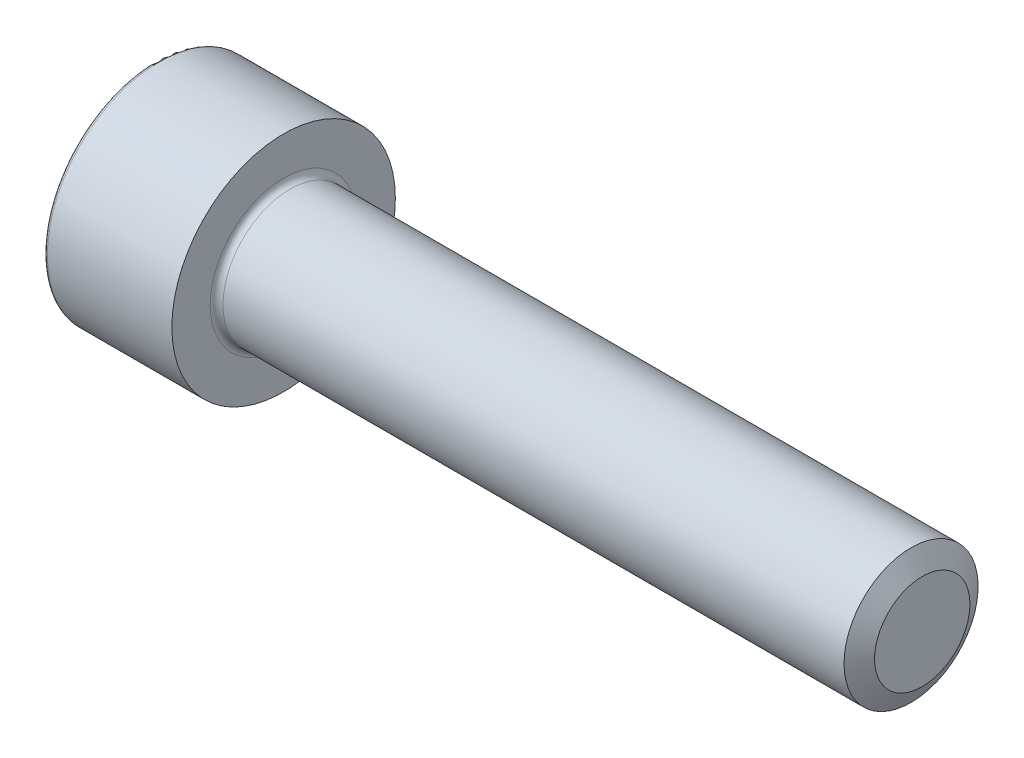
ISO-10303-21;
HEADER;
FILE_DESCRIPTION(('STEP AP214'),'2;1');
FILE_NAME('part.step','',(''),(''),'','','');
FILE_SCHEMA(('AUTOMOTIVE_DESIGN { 1 0 10303 214 1 1 1 1 }'));
ENDSEC;
DATA;
#1=APPLICATION_CONTEXT('core data for automotive mechanical design processes');
#2=APPLICATION_PROTOCOL_DEFINITION('international standard','automotive_design',2000,#1);
#3=PRODUCT_CONTEXT('',#1,'mechanical');
#4=PRODUCT('Part','Part','',(#3));
#5=PRODUCT_RELATED_PRODUCT_CATEGORY('part','',(#4));
#6=PRODUCT_DEFINITION_FORMATION('','',#4);
#7=PRODUCT_DEFINITION_CONTEXT('part definition',#1,'design');
#8=PRODUCT_DEFINITION('design','',#6,#7);
#9=PRODUCT_DEFINITION_SHAPE('','',#8);
#10=(LENGTH_UNIT() NAMED_UNIT(*) SI_UNIT(.MILLI.,.METRE.));
#11=(NAMED_UNIT(*) PLANE_ANGLE_UNIT() SI_UNIT($,.RADIAN.));
#12=(NAMED_UNIT(*) SI_UNIT($,.STERADIAN.) SOLID_ANGLE_UNIT());
#13=UNCERTAINTY_MEASURE_WITH_UNIT(LENGTH_MEASURE(1.E-05),#10,'distance_accuracy_value','');
#14=(GEOMETRIC_REPRESENTATION_CONTEXT(3) GLOBAL_UNCERTAINTY_ASSIGNED_CONTEXT((#13)) GLOBAL_UNIT_ASSIGNED_CONTEXT((#10,
#11,#12)) REPRESENTATION_CONTEXT('',''));
#15=CARTESIAN_POINT('',(0.,0.,0.));
#16=DIRECTION('',(0.,0.,1.));
#17=DIRECTION('',(1.,0.,0.));
#18=AXIS2_PLACEMENT_3D('',#15,#16,#17);
#19=CARTESIAN_POINT('',(0.,0.,0.));
#20=DIRECTION('',(-1.,0.,0.));
#21=DIRECTION('',(0.,0.,1.));
#22=AXIS2_PLACEMENT_3D('',#19,#20,#21);
#23=CYLINDRICAL_SURFACE('',#22,2.1);
#24=CARTESIAN_POINT('',(4.2,0.,0.));
#25=DIRECTION('',(-1.,0.,0.));
#26=DIRECTION('',(0.,0.,1.));
#27=AXIS2_PLACEMENT_3D('',#24,#25,#26);
#28=CIRCLE('',#27,2.1);
#29=CARTESIAN_POINT('',(4.2,0.,2.1));
#30=VERTEX_POINT('',#29);
#31=EDGE_CURVE('E146',#30,#30,#28,.T.);
#32=ORIENTED_EDGE('',*,*,#31,.F.);
#33=EDGE_LOOP('',(#32));
#34=FACE_BOUND('',#33,.T.);
#35=CARTESIAN_POINT('',(23.6500102668172,0.,0.));
#36=DIRECTION('',(-1.,0.,0.));
#37=DIRECTION('',(0.,0.,1.));
#38=AXIS2_PLACEMENT_3D('',#35,#36,#37);
#39=CIRCLE('',#38,2.1);
#40=CARTESIAN_POINT('',(23.6500102668172,0.,2.1));
#41=VERTEX_POINT('',#40);
#42=EDGE_CURVE('E283',#41,#41,#39,.T.);
#43=ORIENTED_EDGE('',*,*,#42,.T.);
#44=EDGE_LOOP('',(#43));
#45=FACE_BOUND('',#44,.T.);
#46=ADVANCED_FACE('F43',(#34,#45),#23,.T.);
#47=CARTESIAN_POINT('',(0.,0.,0.));
#48=DIRECTION('',(1.,0.,0.));
#49=DIRECTION('',(0.,0.,-1.));
#50=AXIS2_PLACEMENT_3D('',#47,#48,#49);
#51=PLANE('',#50);
#52=CARTESIAN_POINT('',(0.,0.,0.));
#53=DIRECTION('',(1.,0.,0.));
#54=DIRECTION('',(0.,0.,-1.));
#55=AXIS2_PLACEMENT_3D('',#52,#53,#54);
#56=CIRCLE('',#55,3.4);
#57=CARTESIAN_POINT('',(0.,0.,-3.4));
#58=VERTEX_POINT('',#57);
#59=EDGE_CURVE('E51',#58,#58,#56,.F.);
#60=ORIENTED_EDGE('',*,*,#59,.T.);
#61=EDGE_LOOP('',(#60));
#62=FACE_BOUND('',#61,.T.);
#63=DIRECTION('',(0.,0.866025403784438,-0.5));
#64=VECTOR('',#63,1.);
#65=CARTESIAN_POINT('',(0.,0.,1.72));
#66=LINE('',#65,#64);
#67=CARTESIAN_POINT('',(0.,0.,1.72));
#68=VERTEX_POINT('',#67);
#69=CARTESIAN_POINT('',(0.,1.48956369450923,0.859999999999999));
#70=VERTEX_POINT('',#69);
#71=EDGE_CURVE('E132',#68,#70,#66,.T.);
#72=ORIENTED_EDGE('',*,*,#71,.F.);
#73=DIRECTION('',(0.,0.866025403784439,0.5));
#74=VECTOR('',#73,1.);
#75=CARTESIAN_POINT('',(0.,-1.48956369450923,0.86));
#76=LINE('',#75,#74);
#77=CARTESIAN_POINT('',(0.,-1.48956369450923,0.86));
#78=VERTEX_POINT('',#77);
#79=EDGE_CURVE('E58',#78,#68,#76,.T.);
#80=ORIENTED_EDGE('',*,*,#79,.F.);
#81=DIRECTION('',(0.,0.,1.));
#82=VECTOR('',#81,1.);
#83=CARTESIAN_POINT('',(0.,-1.48956369450923,-0.86));
#84=LINE('',#83,#82);
#85=CARTESIAN_POINT('',(0.,-1.48956369450923,-0.86));
#86=VERTEX_POINT('',#85);
#87=EDGE_CURVE('E142',#86,#78,#84,.T.);
#88=ORIENTED_EDGE('',*,*,#87,.F.);
#89=DIRECTION('',(0.,-0.866025403784439,0.5));
#90=VECTOR('',#89,1.);
#91=CARTESIAN_POINT('',(0.,0.,-1.72));
#92=LINE('',#91,#90);
#93=CARTESIAN_POINT('',(0.,0.,-1.72));
#94=VERTEX_POINT('',#93);
#95=EDGE_CURVE('E140',#94,#86,#92,.T.);
#96=ORIENTED_EDGE('',*,*,#95,.F.);
#97=DIRECTION('',(0.,-0.866025403784439,-0.5));
#98=VECTOR('',#97,1.);
#99=CARTESIAN_POINT('',(0.,1.48956369450923,-0.86));
#100=LINE('',#99,#98);
#101=CARTESIAN_POINT('',(0.,1.48956369450923,-0.86));
#102=VERTEX_POINT('',#101);
#103=EDGE_CURVE('E106',#102,#94,#100,.T.);
#104=ORIENTED_EDGE('',*,*,#103,.F.);
#105=DIRECTION('',(0.,0.,-1.));
#106=VECTOR('',#105,1.);
#107=CARTESIAN_POINT('',(0.,1.48956369450923,0.859999999999999));
#108=LINE('',#107,#106);
#109=EDGE_CURVE('E136',#70,#102,#108,.T.);
#110=ORIENTED_EDGE('',*,*,#109,.F.);
#111=EDGE_LOOP('',(#72,#80,#88,#96,#104,#110));
#112=FACE_BOUND('',#111,.T.);
#113=ADVANCED_FACE('F163',(#62,#112),#51,.F.);
#114=CARTESIAN_POINT('',(0.,0.,0.));
#115=DIRECTION('',(-1.,0.,0.));
#116=DIRECTION('',(0.,0.,1.));
#117=AXIS2_PLACEMENT_3D('',#114,#115,#116);
#118=CYLINDRICAL_SURFACE('',#117,3.5);
#119=CARTESIAN_POINT('',(0.1,0.,0.));
#120=DIRECTION('',(1.,0.,0.));
#121=DIRECTION('',(0.,0.,-1.));
#122=AXIS2_PLACEMENT_3D('',#119,#120,#121);
#123=CIRCLE('',#122,3.5);
#124=CARTESIAN_POINT('',(0.1,0.,-3.5));
#125=VERTEX_POINT('',#124);
#126=EDGE_CURVE('E11',#125,#125,#123,.T.);
#127=ORIENTED_EDGE('',*,*,#126,.T.);
#128=EDGE_LOOP('',(#127));
#129=FACE_BOUND('',#128,.T.);
#130=CARTESIAN_POINT('',(4.,0.,0.));
#131=DIRECTION('',(-1.,0.,0.));
#132=DIRECTION('',(0.,0.,1.));
#133=AXIS2_PLACEMENT_3D('',#130,#131,#132);
#134=CIRCLE('',#133,3.5);
#135=CARTESIAN_POINT('',(4.,0.,3.5));
#136=VERTEX_POINT('',#135);
#137=EDGE_CURVE('E157',#136,#136,#134,.T.);
#138=ORIENTED_EDGE('',*,*,#137,.T.);
#139=EDGE_LOOP('',(#138));
#140=FACE_BOUND('',#139,.T.);
#141=ADVANCED_FACE('F182',(#129,#140),#118,.T.);
#142=CARTESIAN_POINT('',(4.,3.5,0.));
#143=DIRECTION('',(-1.,0.,0.));
#144=DIRECTION('',(0.,0.,1.));
#145=AXIS2_PLACEMENT_3D('',#142,#143,#144);
#146=PLANE('',#145);
#147=ORIENTED_EDGE('',*,*,#137,.F.);
#148=EDGE_LOOP('',(#147));
#149=FACE_BOUND('',#148,.T.);
#150=CARTESIAN_POINT('',(4.,0.,0.));
#151=DIRECTION('',(-1.,0.,0.));
#152=DIRECTION('',(0.,0.,1.));
#153=AXIS2_PLACEMENT_3D('',#150,#151,#152);
#154=CIRCLE('',#153,2.3);
#155=CARTESIAN_POINT('',(4.,0.,2.3));
#156=VERTEX_POINT('',#155);
#157=EDGE_CURVE('E154',#156,#156,#154,.T.);
#158=ORIENTED_EDGE('',*,*,#157,.T.);
#159=EDGE_LOOP('',(#158));
#160=FACE_BOUND('',#159,.T.);
#161=ADVANCED_FACE('F191',(#149,#160),#146,.F.);
#162=CARTESIAN_POINT('',(4.2,0.,0.));
#163=DIRECTION('',(-1.,0.,0.));
#164=DIRECTION('',(0.,0.,1.));
#165=AXIS2_PLACEMENT_3D('',#162,#163,#164);
#166=TOROIDAL_SURFACE('',#165,2.3,0.2);
#167=ORIENTED_EDGE('',*,*,#157,.F.);
#168=EDGE_LOOP('',(#167));
#169=FACE_BOUND('',#168,.T.);
#170=ORIENTED_EDGE('',*,*,#31,.T.);
#171=EDGE_LOOP('',(#170));
#172=FACE_BOUND('',#171,.T.);
#173=ADVANCED_FACE('F187',(#169,#172),#166,.F.);
#174=CARTESIAN_POINT('',(2.,-1.48956369450923,0.86));
#175=DIRECTION('',(0.,-0.5,0.866025403784439));
#176=DIRECTION('',(0.,-0.866025403784439,-0.5));
#177=AXIS2_PLACEMENT_3D('',#174,#175,#176);
#178=PLANE('',#177);
#179=ORIENTED_EDGE('',*,*,#79,.T.);
#180=DIRECTION('',(-1.,0.,0.));
#181=VECTOR('',#180,1.);
#182=CARTESIAN_POINT('',(2.,0.,1.72));
#183=LINE('',#182,#181);
#184=CARTESIAN_POINT('',(2.,0.,1.72));
#185=VERTEX_POINT('',#184);
#186=EDGE_CURVE('E88',#185,#68,#183,.T.);
#187=ORIENTED_EDGE('',*,*,#186,.F.);
#188=DIRECTION('',(0.,0.866025403784439,0.5));
#189=VECTOR('',#188,1.);
#190=CARTESIAN_POINT('',(2.,-1.48956369450923,0.86));
#191=LINE('',#190,#189);
#192=CARTESIAN_POINT('',(2.,-1.48956369450923,0.86));
#193=VERTEX_POINT('',#192);
#194=EDGE_CURVE('E144',#193,#185,#191,.T.);
#195=ORIENTED_EDGE('',*,*,#194,.F.);
#196=DIRECTION('',(-1.,0.,0.));
#197=VECTOR('',#196,1.);
#198=CARTESIAN_POINT('',(2.,-1.48956369450923,0.86));
#199=LINE('',#198,#197);
#200=EDGE_CURVE('E66',#193,#78,#199,.T.);
#201=ORIENTED_EDGE('',*,*,#200,.T.);
#202=EDGE_LOOP('',(#179,#187,#195,#201));
#203=FACE_BOUND('',#202,.T.);
#204=ADVANCED_FACE('F190',(#203),#178,.F.);
#205=CARTESIAN_POINT('',(2.,-1.48956369450923,-0.86));
#206=DIRECTION('',(0.,-1.,0.));
#207=DIRECTION('',(0.,0.,-1.));
#208=AXIS2_PLACEMENT_3D('',#205,#206,#207);
#209=PLANE('',#208);
#210=ORIENTED_EDGE('',*,*,#87,.T.);
#211=ORIENTED_EDGE('',*,*,#200,.F.);
#212=DIRECTION('',(0.,0.,1.));
#213=VECTOR('',#212,1.);
#214=CARTESIAN_POINT('',(2.,-1.48956369450923,-0.86));
#215=LINE('',#214,#213);
#216=CARTESIAN_POINT('',(2.,-1.48956369450923,-0.86));
#217=VERTEX_POINT('',#216);
#218=EDGE_CURVE('E118',#217,#193,#215,.T.);
#219=ORIENTED_EDGE('',*,*,#218,.F.);
#220=DIRECTION('',(-1.,0.,0.));
#221=VECTOR('',#220,1.);
#222=CARTESIAN_POINT('',(2.,-1.48956369450923,-0.86));
#223=LINE('',#222,#221);
#224=EDGE_CURVE('E110',#217,#86,#223,.T.);
#225=ORIENTED_EDGE('',*,*,#224,.T.);
#226=EDGE_LOOP('',(#210,#211,#219,#225));
#227=FACE_BOUND('',#226,.T.);
#228=ADVANCED_FACE('F221',(#227),#209,.F.);
#229=CARTESIAN_POINT('',(2.,0.,-1.72));
#230=DIRECTION('',(0.,-0.5,-0.866025403784439));
#231=DIRECTION('',(0.,0.866025403784439,-0.5));
#232=AXIS2_PLACEMENT_3D('',#229,#230,#231);
#233=PLANE('',#232);
#234=ORIENTED_EDGE('',*,*,#95,.T.);
#235=ORIENTED_EDGE('',*,*,#224,.F.);
#236=DIRECTION('',(0.,-0.866025403784439,0.5));
#237=VECTOR('',#236,1.);
#238=CARTESIAN_POINT('',(2.,0.,-1.72));
#239=LINE('',#238,#237);
#240=CARTESIAN_POINT('',(2.,0.,-1.72));
#241=VERTEX_POINT('',#240);
#242=EDGE_CURVE('E114',#241,#217,#239,.T.);
#243=ORIENTED_EDGE('',*,*,#242,.F.);
#244=DIRECTION('',(-1.,0.,0.));
#245=VECTOR('',#244,1.);
#246=CARTESIAN_POINT('',(2.,0.,-1.72));
#247=LINE('',#246,#245);
#248=EDGE_CURVE('E99',#241,#94,#247,.T.);
#249=ORIENTED_EDGE('',*,*,#248,.T.);
#250=EDGE_LOOP('',(#234,#235,#243,#249));
#251=FACE_BOUND('',#250,.T.);
#252=ADVANCED_FACE('F115',(#251),#233,.F.);
#253=CARTESIAN_POINT('',(2.,1.48956369450923,-0.86));
#254=DIRECTION('',(0.,0.5,-0.866025403784439));
#255=DIRECTION('',(0.,0.866025403784439,0.5));
#256=AXIS2_PLACEMENT_3D('',#253,#254,#255);
#257=PLANE('',#256);
#258=ORIENTED_EDGE('',*,*,#103,.T.);
#259=ORIENTED_EDGE('',*,*,#248,.F.);
#260=DIRECTION('',(0.,-0.866025403784439,-0.5));
#261=VECTOR('',#260,1.);
#262=CARTESIAN_POINT('',(2.,1.48956369450923,-0.86));
#263=LINE('',#262,#261);
#264=CARTESIAN_POINT('',(2.,1.48956369450923,-0.86));
#265=VERTEX_POINT('',#264);
#266=EDGE_CURVE('E103',#265,#241,#263,.T.);
#267=ORIENTED_EDGE('',*,*,#266,.F.);
#268=DIRECTION('',(-1.,0.,0.));
#269=VECTOR('',#268,1.);
#270=CARTESIAN_POINT('',(2.,1.48956369450923,-0.86));
#271=LINE('',#270,#269);
#272=EDGE_CURVE('E111',#265,#102,#271,.T.);
#273=ORIENTED_EDGE('',*,*,#272,.T.);
#274=EDGE_LOOP('',(#258,#259,#267,#273));
#275=FACE_BOUND('',#274,.T.);
#276=ADVANCED_FACE('F101',(#275),#257,.F.);
#277=CARTESIAN_POINT('',(2.,1.48956369450923,0.859999999999999));
#278=DIRECTION('',(0.,1.,0.));
#279=DIRECTION('',(0.,0.,1.));
#280=AXIS2_PLACEMENT_3D('',#277,#278,#279);
#281=PLANE('',#280);
#282=ORIENTED_EDGE('',*,*,#109,.T.);
#283=ORIENTED_EDGE('',*,*,#272,.F.);
#284=DIRECTION('',(0.,0.,-1.));
#285=VECTOR('',#284,1.);
#286=CARTESIAN_POINT('',(2.,1.48956369450923,0.859999999999999));
#287=LINE('',#286,#285);
#288=CARTESIAN_POINT('',(2.,1.48956369450923,0.859999999999999));
#289=VERTEX_POINT('',#288);
#290=EDGE_CURVE('E124',#289,#265,#287,.T.);
#291=ORIENTED_EDGE('',*,*,#290,.F.);
#292=DIRECTION('',(-1.,0.,0.));
#293=VECTOR('',#292,1.);
#294=CARTESIAN_POINT('',(2.,1.48956369450923,0.859999999999999));
#295=LINE('',#294,#293);
#296=EDGE_CURVE('E149',#289,#70,#295,.T.);
#297=ORIENTED_EDGE('',*,*,#296,.T.);
#298=EDGE_LOOP('',(#282,#283,#291,#297));
#299=FACE_BOUND('',#298,.T.);
#300=ADVANCED_FACE('F239',(#299),#281,.F.);
#301=CARTESIAN_POINT('',(2.,0.,1.72));
#302=DIRECTION('',(0.,0.5,0.866025403784439));
#303=DIRECTION('',(0.,-0.866025403784438,0.5));
#304=AXIS2_PLACEMENT_3D('',#301,#302,#303);
#305=PLANE('',#304);
#306=ORIENTED_EDGE('',*,*,#71,.T.);
#307=ORIENTED_EDGE('',*,*,#296,.F.);
#308=DIRECTION('',(0.,0.866025403784438,-0.5));
#309=VECTOR('',#308,1.);
#310=CARTESIAN_POINT('',(2.,0.,1.72));
#311=LINE('',#310,#309);
#312=EDGE_CURVE('E126',#185,#289,#311,.T.);
#313=ORIENTED_EDGE('',*,*,#312,.F.);
#314=ORIENTED_EDGE('',*,*,#186,.T.);
#315=EDGE_LOOP('',(#306,#307,#313,#314));
#316=FACE_BOUND('',#315,.T.);
#317=ADVANCED_FACE('F246',(#316),#305,.F.);
#318=CARTESIAN_POINT('',(2.,1.48956369450923,2.58));
#319=DIRECTION('',(-1.,0.,0.));
#320=DIRECTION('',(0.,0.,1.));
#321=AXIS2_PLACEMENT_3D('',#318,#319,#320);
#322=PLANE('',#321);
#323=ORIENTED_EDGE('',*,*,#194,.T.);
#324=ORIENTED_EDGE('',*,*,#312,.T.);
#325=ORIENTED_EDGE('',*,*,#290,.T.);
#326=ORIENTED_EDGE('',*,*,#266,.T.);
#327=ORIENTED_EDGE('',*,*,#242,.T.);
#328=ORIENTED_EDGE('',*,*,#218,.T.);
#329=EDGE_LOOP('',(#323,#324,#325,#326,#327,#328));
#330=FACE_BOUND('',#329,.T.);
#331=ADVANCED_FACE('F121',(#330),#322,.T.);
#332=CARTESIAN_POINT('',(23.6500102668172,0.,0.));
#333=DIRECTION('',(-1.,0.,0.));
#334=DIRECTION('',(0.,0.,1.));
#335=AXIS2_PLACEMENT_3D('',#332,#333,#334);
#336=CONICAL_SURFACE('',#335,2.1,1.04719755119659);
#337=CARTESIAN_POINT('',(24.,0.,0.));
#338=DIRECTION('',(-1.,0.,0.));
#339=DIRECTION('',(0.,0.,1.));
#340=AXIS2_PLACEMENT_3D('',#337,#338,#339);
#341=CIRCLE('',#340,1.4938);
#342=CARTESIAN_POINT('',(24.,0.,1.4938));
#343=VERTEX_POINT('',#342);
#344=EDGE_CURVE('E133',#343,#343,#341,.T.);
#345=ORIENTED_EDGE('',*,*,#344,.T.);
#346=EDGE_LOOP('',(#345));
#347=FACE_BOUND('',#346,.T.);
#348=ORIENTED_EDGE('',*,*,#42,.F.);
#349=EDGE_LOOP('',(#348));
#350=FACE_BOUND('',#349,.T.);
#351=ADVANCED_FACE('F172',(#347,#350),#336,.T.);
#352=CARTESIAN_POINT('',(24.,2.1,0.));
#353=DIRECTION('',(-1.,0.,0.));
#354=DIRECTION('',(0.,0.,1.));
#355=AXIS2_PLACEMENT_3D('',#352,#353,#354);
#356=PLANE('',#355);
#357=ORIENTED_EDGE('',*,*,#344,.F.);
#358=EDGE_LOOP('',(#357));
#359=FACE_BOUND('',#358,.T.);
#360=ADVANCED_FACE('F167',(#359),#356,.F.);
#361=CARTESIAN_POINT('',(0.1,0.,0.));
#362=DIRECTION('',(1.,0.,0.));
#363=DIRECTION('',(0.,0.,-1.));
#364=AXIS2_PLACEMENT_3D('',#361,#362,#363);
#365=TOROIDAL_SURFACE('',#364,3.4,0.1);
#366=ORIENTED_EDGE('',*,*,#126,.F.);
#367=EDGE_LOOP('',(#366));
#368=FACE_BOUND('',#367,.T.);
#369=ORIENTED_EDGE('',*,*,#59,.F.);
#370=EDGE_LOOP('',(#369));
#371=FACE_BOUND('',#370,.T.);
#372=ADVANCED_FACE('F45',(#368,#371),#365,.T.);
#373=CLOSED_SHELL('',(#46,#113,#141,#161,#173,#204,#228,#252,#276,#300,#317,#331,#351,#360,#372));
#374=MANIFOLD_SOLID_BREP('B2',#373);
#375=ADVANCED_BREP_SHAPE_REPRESENTATION('',(#18,#374),#14);
#376=SHAPE_DEFINITION_REPRESENTATION(#9,#375);
ENDSEC;
END-ISO-10303-21;
